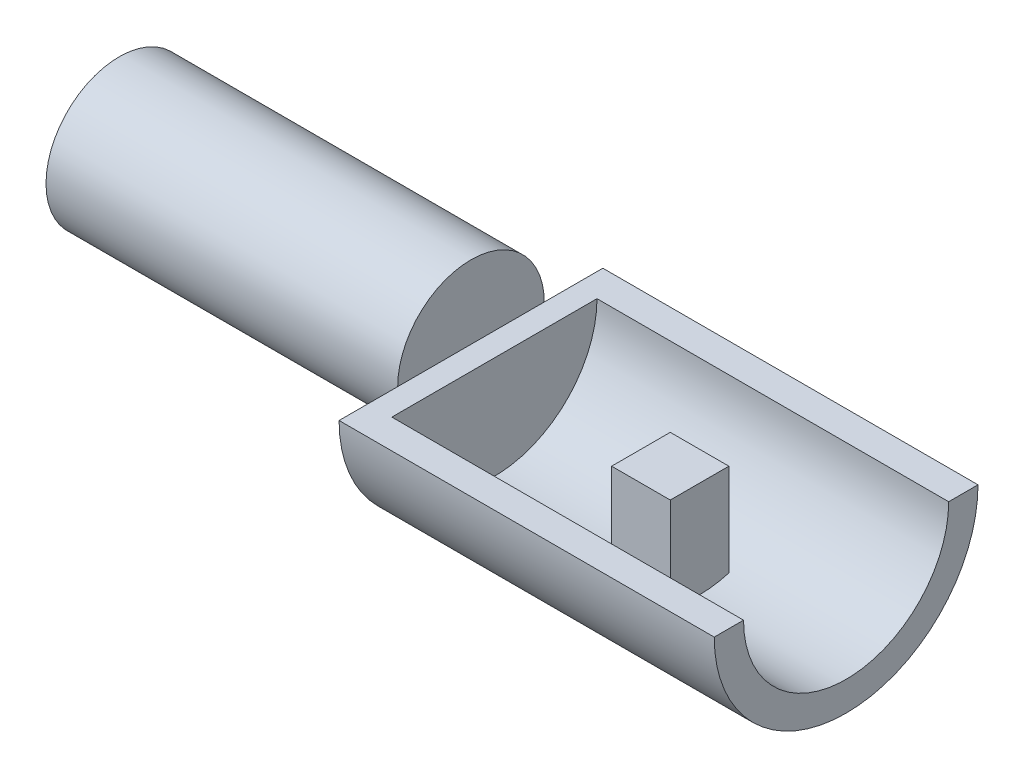
ISO-10303-21;
HEADER;
FILE_DESCRIPTION(('STEP AP214'),'2;1');
FILE_NAME('part.step','',(''),(''),'','','');
FILE_SCHEMA(('AUTOMOTIVE_DESIGN { 1 0 10303 214 1 1 1 1 }'));
ENDSEC;
DATA;
#1=APPLICATION_CONTEXT('core data for automotive mechanical design processes');
#2=APPLICATION_PROTOCOL_DEFINITION('international standard','automotive_design',2000,#1);
#3=PRODUCT_CONTEXT('',#1,'mechanical');
#4=PRODUCT('Part','Part','',(#3));
#5=PRODUCT_RELATED_PRODUCT_CATEGORY('part','',(#4));
#6=PRODUCT_DEFINITION_FORMATION('','',#4);
#7=PRODUCT_DEFINITION_CONTEXT('part definition',#1,'design');
#8=PRODUCT_DEFINITION('design','',#6,#7);
#9=PRODUCT_DEFINITION_SHAPE('','',#8);
#10=(LENGTH_UNIT() NAMED_UNIT(*) SI_UNIT(.MILLI.,.METRE.));
#11=(NAMED_UNIT(*) PLANE_ANGLE_UNIT() SI_UNIT($,.RADIAN.));
#12=(NAMED_UNIT(*) SI_UNIT($,.STERADIAN.) SOLID_ANGLE_UNIT());
#13=UNCERTAINTY_MEASURE_WITH_UNIT(LENGTH_MEASURE(1.E-05),#10,'distance_accuracy_value','');
#14=(GEOMETRIC_REPRESENTATION_CONTEXT(3) GLOBAL_UNCERTAINTY_ASSIGNED_CONTEXT((#13)) GLOBAL_UNIT_ASSIGNED_CONTEXT((#10,
#11,#12)) REPRESENTATION_CONTEXT('',''));
#15=CARTESIAN_POINT('',(0.,0.,0.));
#16=DIRECTION('',(0.,0.,1.));
#17=DIRECTION('',(1.,0.,0.));
#18=AXIS2_PLACEMENT_3D('',#15,#16,#17);
#19=CARTESIAN_POINT('',(-30.,0.,0.));
#20=DIRECTION('',(1.,0.,0.));
#21=DIRECTION('',(0.,0.,-1.));
#22=AXIS2_PLACEMENT_3D('',#19,#20,#21);
#23=CYLINDRICAL_SURFACE('',#22,17.5);
#24=CARTESIAN_POINT('',(-5.,0.,0.));
#25=DIRECTION('',(-1.,0.,0.));
#26=DIRECTION('',(0.,0.,1.));
#27=AXIS2_PLACEMENT_3D('',#24,#25,#26);
#28=CIRCLE('',#27,17.5);
#29=CARTESIAN_POINT('',(-5.,-16.7705098312484,5.00000000000001));
#30=VERTEX_POINT('',#29);
#31=CARTESIAN_POINT('',(-5.,-16.7705098312484,-4.99999999999999));
#32=VERTEX_POINT('',#31);
#33=EDGE_CURVE('E62',#30,#32,#28,.F.);
#34=ORIENTED_EDGE('',*,*,#33,.T.);
#35=DIRECTION('',(1.,0.,0.));
#36=VECTOR('',#35,1.);
#37=CARTESIAN_POINT('',(-30.,-16.7705098312484,-4.99999999999999));
#38=LINE('',#37,#36);
#39=CARTESIAN_POINT('',(5.,-16.7705098312484,-5.));
#40=VERTEX_POINT('',#39);
#41=EDGE_CURVE('E143',#32,#40,#38,.T.);
#42=ORIENTED_EDGE('',*,*,#41,.T.);
#43=CARTESIAN_POINT('',(5.,0.,0.));
#44=DIRECTION('',(1.,0.,0.));
#45=DIRECTION('',(0.,0.,-1.));
#46=AXIS2_PLACEMENT_3D('',#43,#44,#45);
#47=CIRCLE('',#46,17.5);
#48=CARTESIAN_POINT('',(5.,-16.7705098312484,5.));
#49=VERTEX_POINT('',#48);
#50=EDGE_CURVE('E141',#40,#49,#47,.F.);
#51=ORIENTED_EDGE('',*,*,#50,.T.);
#52=DIRECTION('',(1.,0.,0.));
#53=VECTOR('',#52,1.);
#54=CARTESIAN_POINT('',(-30.,-16.7705098312484,5.00000000000001));
#55=LINE('',#54,#53);
#56=EDGE_CURVE('E147',#49,#30,#55,.F.);
#57=ORIENTED_EDGE('',*,*,#56,.T.);
#58=EDGE_LOOP('',(#34,#42,#51,#57));
#59=FACE_BOUND('',#58,.T.);
#60=DIRECTION('',(1.,0.,0.));
#61=VECTOR('',#60,1.);
#62=CARTESIAN_POINT('',(-30.,0.,17.5));
#63=LINE('',#62,#61);
#64=CARTESIAN_POINT('',(-30.,0.,17.5));
#65=VERTEX_POINT('',#64);
#66=CARTESIAN_POINT('',(30.,0.,17.5));
#67=VERTEX_POINT('',#66);
#68=EDGE_CURVE('E42',#65,#67,#63,.T.);
#69=ORIENTED_EDGE('',*,*,#68,.T.);
#70=CARTESIAN_POINT('',(30.,0.,0.));
#71=DIRECTION('',(-1.,0.,0.));
#72=DIRECTION('',(0.,0.,-1.));
#73=AXIS2_PLACEMENT_3D('',#70,#71,#72);
#74=CIRCLE('',#73,17.5);
#75=CARTESIAN_POINT('',(30.,0.,-17.5));
#76=VERTEX_POINT('',#75);
#77=EDGE_CURVE('E167',#76,#67,#74,.T.);
#78=ORIENTED_EDGE('',*,*,#77,.F.);
#79=DIRECTION('',(1.,0.,0.));
#80=VECTOR('',#79,1.);
#81=CARTESIAN_POINT('',(-30.,0.,-17.5));
#82=LINE('',#81,#80);
#83=CARTESIAN_POINT('',(-30.,0.,-17.5));
#84=VERTEX_POINT('',#83);
#85=EDGE_CURVE('E47',#84,#76,#82,.T.);
#86=ORIENTED_EDGE('',*,*,#85,.F.);
#87=CARTESIAN_POINT('',(-30.,0.,0.));
#88=DIRECTION('',(-1.,0.,0.));
#89=DIRECTION('',(0.,0.,-1.));
#90=AXIS2_PLACEMENT_3D('',#87,#88,#89);
#91=CIRCLE('',#90,17.5);
#92=EDGE_CURVE('E179',#84,#65,#91,.T.);
#93=ORIENTED_EDGE('',*,*,#92,.T.);
#94=EDGE_LOOP('',(#69,#78,#86,#93));
#95=FACE_BOUND('',#94,.T.);
#96=ADVANCED_FACE('F39',(#59,#95),#23,.F.);
#97=CARTESIAN_POINT('',(-30.,0.,-17.5));
#98=DIRECTION('',(0.,1.,0.));
#99=DIRECTION('',(0.,0.,1.));
#100=AXIS2_PLACEMENT_3D('',#97,#98,#99);
#101=PLANE('',#100);
#102=ORIENTED_EDGE('',*,*,#85,.T.);
#103=DIRECTION('',(0.,0.,1.));
#104=VECTOR('',#103,1.);
#105=CARTESIAN_POINT('',(30.,0.,-17.5));
#106=LINE('',#105,#104);
#107=CARTESIAN_POINT('',(30.,0.,-22.5));
#108=VERTEX_POINT('',#107);
#109=EDGE_CURVE('E176',#108,#76,#106,.T.);
#110=ORIENTED_EDGE('',*,*,#109,.F.);
#111=DIRECTION('',(1.,0.,0.));
#112=VECTOR('',#111,1.);
#113=CARTESIAN_POINT('',(-30.,0.,-22.5));
#114=LINE('',#113,#112);
#115=CARTESIAN_POINT('',(-34.,0.,-22.5));
#116=VERTEX_POINT('',#115);
#117=EDGE_CURVE('E183',#116,#108,#114,.T.);
#118=ORIENTED_EDGE('',*,*,#117,.F.);
#119=DIRECTION('',(0.,0.,-1.));
#120=VECTOR('',#119,1.);
#121=CARTESIAN_POINT('',(-34.,0.,-22.5));
#122=LINE('',#121,#120);
#123=CARTESIAN_POINT('',(-34.,0.,-12.5));
#124=VERTEX_POINT('',#123);
#125=EDGE_CURVE('E118',#124,#116,#122,.T.);
#126=ORIENTED_EDGE('',*,*,#125,.F.);
#127=CARTESIAN_POINT('',(-34.,0.,12.5));
#128=VERTEX_POINT('',#127);
#129=EDGE_CURVE('E116',#128,#124,#122,.T.);
#130=ORIENTED_EDGE('',*,*,#129,.F.);
#131=CARTESIAN_POINT('',(-34.,0.,22.5));
#132=VERTEX_POINT('',#131);
#133=EDGE_CURVE('E109',#132,#128,#122,.T.);
#134=ORIENTED_EDGE('',*,*,#133,.F.);
#135=DIRECTION('',(1.,0.,0.));
#136=VECTOR('',#135,1.);
#137=CARTESIAN_POINT('',(-30.,0.,22.5));
#138=LINE('',#137,#136);
#139=CARTESIAN_POINT('',(30.,0.,22.5));
#140=VERTEX_POINT('',#139);
#141=EDGE_CURVE('E184',#132,#140,#138,.T.);
#142=ORIENTED_EDGE('',*,*,#141,.T.);
#143=DIRECTION('',(0.,0.,1.));
#144=VECTOR('',#143,1.);
#145=CARTESIAN_POINT('',(30.,0.,17.5));
#146=LINE('',#145,#144);
#147=EDGE_CURVE('E170',#67,#140,#146,.T.);
#148=ORIENTED_EDGE('',*,*,#147,.F.);
#149=ORIENTED_EDGE('',*,*,#68,.F.);
#150=DIRECTION('',(0.,0.,-1.));
#151=VECTOR('',#150,1.);
#152=CARTESIAN_POINT('',(-30.,0.,-22.5));
#153=LINE('',#152,#151);
#154=EDGE_CURVE('E131',#65,#84,#153,.T.);
#155=ORIENTED_EDGE('',*,*,#154,.T.);
#156=EDGE_LOOP('',(#102,#110,#118,#126,#130,#134,#142,#148,#149,#155));
#157=FACE_BOUND('',#156,.T.);
#158=ADVANCED_FACE('F120',(#157),#101,.T.);
#159=CARTESIAN_POINT('',(-30.,0.,0.));
#160=DIRECTION('',(1.,0.,0.));
#161=DIRECTION('',(0.,0.,-1.));
#162=AXIS2_PLACEMENT_3D('',#159,#160,#161);
#163=CYLINDRICAL_SURFACE('',#162,22.5);
#164=ORIENTED_EDGE('',*,*,#117,.T.);
#165=CARTESIAN_POINT('',(30.,0.,0.));
#166=DIRECTION('',(1.,0.,0.));
#167=DIRECTION('',(0.,0.,-1.));
#168=AXIS2_PLACEMENT_3D('',#165,#166,#167);
#169=CIRCLE('',#168,22.5);
#170=EDGE_CURVE('E173',#140,#108,#169,.T.);
#171=ORIENTED_EDGE('',*,*,#170,.F.);
#172=ORIENTED_EDGE('',*,*,#141,.F.);
#173=CARTESIAN_POINT('',(-34.,0.,0.));
#174=DIRECTION('',(-1.,0.,0.));
#175=DIRECTION('',(0.,0.,1.));
#176=AXIS2_PLACEMENT_3D('',#173,#174,#175);
#177=CIRCLE('',#176,22.5);
#178=EDGE_CURVE('E113',#116,#132,#177,.T.);
#179=ORIENTED_EDGE('',*,*,#178,.F.);
#180=EDGE_LOOP('',(#164,#171,#172,#179));
#181=FACE_BOUND('',#180,.T.);
#182=ADVANCED_FACE('F211',(#181),#163,.T.);
#183=CARTESIAN_POINT('',(30.,0.,0.));
#184=DIRECTION('',(1.,0.,0.));
#185=DIRECTION('',(0.,0.,-1.));
#186=AXIS2_PLACEMENT_3D('',#183,#184,#185);
#187=PLANE('',#186);
#188=ORIENTED_EDGE('',*,*,#77,.T.);
#189=ORIENTED_EDGE('',*,*,#147,.T.);
#190=ORIENTED_EDGE('',*,*,#170,.T.);
#191=ORIENTED_EDGE('',*,*,#109,.T.);
#192=EDGE_LOOP('',(#188,#189,#190,#191));
#193=FACE_BOUND('',#192,.T.);
#194=ADVANCED_FACE('F192',(#193),#187,.T.);
#195=CARTESIAN_POINT('',(-5.,-22.501,5.));
#196=DIRECTION('',(-1.,0.,0.));
#197=DIRECTION('',(0.,0.,1.));
#198=AXIS2_PLACEMENT_3D('',#195,#196,#197);
#199=PLANE('',#198);
#200=ORIENTED_EDGE('',*,*,#33,.F.);
#201=DIRECTION('',(0.,1.,0.));
#202=VECTOR('',#201,1.);
#203=CARTESIAN_POINT('',(-5.,-22.501,5.));
#204=LINE('',#203,#202);
#205=CARTESIAN_POINT('',(-5.,-1.,5.));
#206=VERTEX_POINT('',#205);
#207=EDGE_CURVE('E159',#30,#206,#204,.T.);
#208=ORIENTED_EDGE('',*,*,#207,.T.);
#209=DIRECTION('',(0.,0.,1.));
#210=VECTOR('',#209,1.);
#211=CARTESIAN_POINT('',(-5.,-1.,5.));
#212=LINE('',#211,#210);
#213=CARTESIAN_POINT('',(-5.,-1.,-5.));
#214=VERTEX_POINT('',#213);
#215=EDGE_CURVE('E115',#214,#206,#212,.T.);
#216=ORIENTED_EDGE('',*,*,#215,.F.);
#217=DIRECTION('',(0.,1.,0.));
#218=VECTOR('',#217,1.);
#219=CARTESIAN_POINT('',(-5.,-22.501,-5.));
#220=LINE('',#219,#218);
#221=EDGE_CURVE('E144',#32,#214,#220,.T.);
#222=ORIENTED_EDGE('',*,*,#221,.F.);
#223=EDGE_LOOP('',(#200,#208,#216,#222));
#224=FACE_BOUND('',#223,.T.);
#225=ADVANCED_FACE('F220',(#224),#199,.T.);
#226=CARTESIAN_POINT('',(5.,-22.501,-5.));
#227=DIRECTION('',(0.,0.,-1.));
#228=DIRECTION('',(-1.,0.,0.));
#229=AXIS2_PLACEMENT_3D('',#226,#227,#228);
#230=PLANE('',#229);
#231=ORIENTED_EDGE('',*,*,#41,.F.);
#232=ORIENTED_EDGE('',*,*,#221,.T.);
#233=DIRECTION('',(-1.,0.,0.));
#234=VECTOR('',#233,1.);
#235=CARTESIAN_POINT('',(5.,-1.,-5.));
#236=LINE('',#235,#234);
#237=CARTESIAN_POINT('',(5.,-1.,-5.));
#238=VERTEX_POINT('',#237);
#239=EDGE_CURVE('E156',#238,#214,#236,.T.);
#240=ORIENTED_EDGE('',*,*,#239,.F.);
#241=DIRECTION('',(0.,1.,0.));
#242=VECTOR('',#241,1.);
#243=CARTESIAN_POINT('',(5.,-22.501,-5.));
#244=LINE('',#243,#242);
#245=EDGE_CURVE('E161',#40,#238,#244,.T.);
#246=ORIENTED_EDGE('',*,*,#245,.F.);
#247=EDGE_LOOP('',(#231,#232,#240,#246));
#248=FACE_BOUND('',#247,.T.);
#249=ADVANCED_FACE('F223',(#248),#230,.T.);
#250=CARTESIAN_POINT('',(5.,-22.501,5.));
#251=DIRECTION('',(1.,0.,0.));
#252=DIRECTION('',(0.,0.,-1.));
#253=AXIS2_PLACEMENT_3D('',#250,#251,#252);
#254=PLANE('',#253);
#255=ORIENTED_EDGE('',*,*,#50,.F.);
#256=ORIENTED_EDGE('',*,*,#245,.T.);
#257=DIRECTION('',(0.,0.,-1.));
#258=VECTOR('',#257,1.);
#259=CARTESIAN_POINT('',(5.,-1.,5.));
#260=LINE('',#259,#258);
#261=CARTESIAN_POINT('',(5.,-1.,5.));
#262=VERTEX_POINT('',#261);
#263=EDGE_CURVE('E153',#262,#238,#260,.T.);
#264=ORIENTED_EDGE('',*,*,#263,.F.);
#265=DIRECTION('',(0.,1.,0.));
#266=VECTOR('',#265,1.);
#267=CARTESIAN_POINT('',(5.,-22.501,5.));
#268=LINE('',#267,#266);
#269=EDGE_CURVE('E163',#49,#262,#268,.T.);
#270=ORIENTED_EDGE('',*,*,#269,.F.);
#271=EDGE_LOOP('',(#255,#256,#264,#270));
#272=FACE_BOUND('',#271,.T.);
#273=ADVANCED_FACE('F227',(#272),#254,.T.);
#274=CARTESIAN_POINT('',(5.,-22.501,5.));
#275=DIRECTION('',(0.,0.,1.));
#276=DIRECTION('',(1.,0.,0.));
#277=AXIS2_PLACEMENT_3D('',#274,#275,#276);
#278=PLANE('',#277);
#279=ORIENTED_EDGE('',*,*,#56,.F.);
#280=ORIENTED_EDGE('',*,*,#269,.T.);
#281=DIRECTION('',(1.,0.,0.));
#282=VECTOR('',#281,1.);
#283=CARTESIAN_POINT('',(5.,-1.,5.));
#284=LINE('',#283,#282);
#285=EDGE_CURVE('E150',#206,#262,#284,.T.);
#286=ORIENTED_EDGE('',*,*,#285,.F.);
#287=ORIENTED_EDGE('',*,*,#207,.F.);
#288=EDGE_LOOP('',(#279,#280,#286,#287));
#289=FACE_BOUND('',#288,.T.);
#290=ADVANCED_FACE('F204',(#289),#278,.T.);
#291=CARTESIAN_POINT('',(0.,-1.,0.));
#292=DIRECTION('',(0.,1.,0.));
#293=DIRECTION('',(0.,0.,1.));
#294=AXIS2_PLACEMENT_3D('',#291,#292,#293);
#295=PLANE('',#294);
#296=ORIENTED_EDGE('',*,*,#215,.T.);
#297=ORIENTED_EDGE('',*,*,#285,.T.);
#298=ORIENTED_EDGE('',*,*,#263,.T.);
#299=ORIENTED_EDGE('',*,*,#239,.T.);
#300=EDGE_LOOP('',(#296,#297,#298,#299));
#301=FACE_BOUND('',#300,.T.);
#302=ADVANCED_FACE('F197',(#301),#295,.T.);
#303=CARTESIAN_POINT('',(-30.,0.,0.));
#304=DIRECTION('',(-1.,0.,0.));
#305=DIRECTION('',(0.,0.,1.));
#306=AXIS2_PLACEMENT_3D('',#303,#304,#305);
#307=PLANE('',#306);
#308=ORIENTED_EDGE('',*,*,#92,.F.);
#309=ORIENTED_EDGE('',*,*,#154,.F.);
#310=EDGE_LOOP('',(#308,#309));
#311=FACE_BOUND('',#310,.T.);
#312=ADVANCED_FACE('F195',(#311),#307,.F.);
#313=CARTESIAN_POINT('',(-34.,0.,0.));
#314=DIRECTION('',(-1.,0.,0.));
#315=DIRECTION('',(0.,0.,1.));
#316=AXIS2_PLACEMENT_3D('',#313,#314,#315);
#317=PLANE('',#316);
#318=CARTESIAN_POINT('',(-34.,0.,0.));
#319=DIRECTION('',(-1.,0.,0.));
#320=DIRECTION('',(0.,0.,1.));
#321=AXIS2_PLACEMENT_3D('',#318,#319,#320);
#322=CIRCLE('',#321,12.5);
#323=EDGE_CURVE('E11',#124,#128,#322,.T.);
#324=ORIENTED_EDGE('',*,*,#323,.F.);
#325=ORIENTED_EDGE('',*,*,#125,.T.);
#326=ORIENTED_EDGE('',*,*,#178,.T.);
#327=ORIENTED_EDGE('',*,*,#133,.T.);
#328=EDGE_LOOP('',(#324,#325,#326,#327));
#329=FACE_BOUND('',#328,.T.);
#330=ADVANCED_FACE('F111',(#329),#317,.T.);
#331=CARTESIAN_POINT('',(-34.,0.,0.));
#332=DIRECTION('',(-1.,0.,0.));
#333=DIRECTION('',(0.,0.,1.));
#334=AXIS2_PLACEMENT_3D('',#331,#332,#333);
#335=PLANE('',#334);
#336=EDGE_CURVE('E49',#128,#124,#322,.T.);
#337=ORIENTED_EDGE('',*,*,#336,.F.);
#338=ORIENTED_EDGE('',*,*,#129,.T.);
#339=EDGE_LOOP('',(#337,#338));
#340=FACE_BOUND('',#339,.T.);
#341=ADVANCED_FACE('F127',(#340),#335,.F.);
#342=CARTESIAN_POINT('',(-94.,0.,0.));
#343=DIRECTION('',(1.,0.,0.));
#344=DIRECTION('',(0.,0.,-1.));
#345=AXIS2_PLACEMENT_3D('',#342,#343,#344);
#346=CYLINDRICAL_SURFACE('',#345,12.5);
#347=CARTESIAN_POINT('',(-94.,0.,0.));
#348=DIRECTION('',(-1.,0.,0.));
#349=DIRECTION('',(0.,0.,1.));
#350=AXIS2_PLACEMENT_3D('',#347,#348,#349);
#351=CIRCLE('',#350,12.5);
#352=CARTESIAN_POINT('',(-94.,0.,12.5));
#353=VERTEX_POINT('',#352);
#354=EDGE_CURVE('E128',#353,#353,#351,.T.);
#355=ORIENTED_EDGE('',*,*,#354,.F.);
#356=EDGE_LOOP('',(#355));
#357=FACE_BOUND('',#356,.T.);
#358=ORIENTED_EDGE('',*,*,#336,.T.);
#359=ORIENTED_EDGE('',*,*,#323,.T.);
#360=EDGE_LOOP('',(#358,#359));
#361=FACE_BOUND('',#360,.T.);
#362=ADVANCED_FACE('F126',(#357,#361),#346,.T.);
#363=CARTESIAN_POINT('',(-94.,0.,0.));
#364=DIRECTION('',(-1.,0.,0.));
#365=DIRECTION('',(0.,0.,1.));
#366=AXIS2_PLACEMENT_3D('',#363,#364,#365);
#367=PLANE('',#366);
#368=CARTESIAN_POINT('',(-94.,0.,0.));
#369=DIRECTION('',(-1.,0.,0.));
#370=DIRECTION('',(0.,0.,1.));
#371=AXIS2_PLACEMENT_3D('',#368,#369,#370);
#372=CIRCLE('',#371,11.5);
#373=CARTESIAN_POINT('',(-94.,0.,11.5));
#374=VERTEX_POINT('',#373);
#375=EDGE_CURVE('E134',#374,#374,#372,.T.);
#376=ORIENTED_EDGE('',*,*,#375,.F.);
#377=EDGE_LOOP('',(#376));
#378=FACE_BOUND('',#377,.T.);
#379=ORIENTED_EDGE('',*,*,#354,.T.);
#380=EDGE_LOOP('',(#379));
#381=FACE_BOUND('',#380,.T.);
#382=ADVANCED_FACE('F305',(#378,#381),#367,.T.);
#383=CARTESIAN_POINT('',(-87.,0.,0.));
#384=DIRECTION('',(-1.,0.,0.));
#385=DIRECTION('',(0.,0.,1.));
#386=AXIS2_PLACEMENT_3D('',#383,#384,#385);
#387=CYLINDRICAL_SURFACE('',#386,11.5);
#388=CARTESIAN_POINT('',(-87.,0.,0.));
#389=DIRECTION('',(-1.,0.,0.));
#390=DIRECTION('',(0.,0.,1.));
#391=AXIS2_PLACEMENT_3D('',#388,#389,#390);
#392=CIRCLE('',#391,11.5);
#393=CARTESIAN_POINT('',(-87.,0.,11.5));
#394=VERTEX_POINT('',#393);
#395=EDGE_CURVE('E129',#394,#394,#392,.T.);
#396=ORIENTED_EDGE('',*,*,#395,.F.);
#397=EDGE_LOOP('',(#396));
#398=FACE_BOUND('',#397,.T.);
#399=ORIENTED_EDGE('',*,*,#375,.T.);
#400=EDGE_LOOP('',(#399));
#401=FACE_BOUND('',#400,.T.);
#402=ADVANCED_FACE('F315',(#398,#401),#387,.F.);
#403=CARTESIAN_POINT('',(-87.,0.,0.));
#404=DIRECTION('',(-1.,0.,0.));
#405=DIRECTION('',(0.,0.,1.));
#406=AXIS2_PLACEMENT_3D('',#403,#404,#405);
#407=PLANE('',#406);
#408=ORIENTED_EDGE('',*,*,#395,.T.);
#409=EDGE_LOOP('',(#408));
#410=FACE_BOUND('',#409,.T.);
#411=ADVANCED_FACE('F325',(#410),#407,.T.);
#412=CLOSED_SHELL('',(#96,#158,#182,#194,#225,#249,#273,#290,#302,#312,#330,#341,#362,#382,#402,#411));
#413=MANIFOLD_SOLID_BREP('B2',#412);
#414=ADVANCED_BREP_SHAPE_REPRESENTATION('',(#18,#413),#14);
#415=SHAPE_DEFINITION_REPRESENTATION(#9,#414);
ENDSEC;
END-ISO-10303-21;
